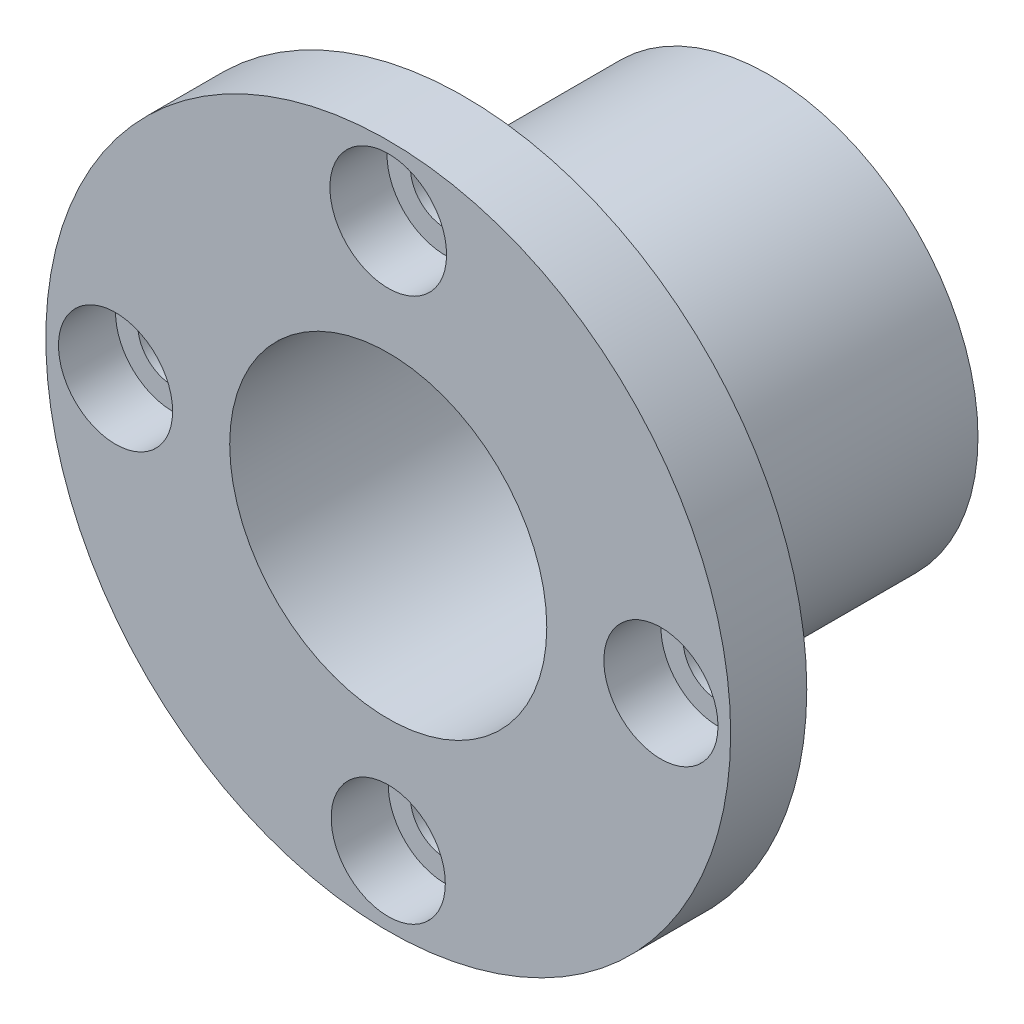
ISO-10303-21;
HEADER;
FILE_DESCRIPTION(('STEP AP214'),'2;1');
FILE_NAME('part.step','',(''),(''),'','','');
FILE_SCHEMA(('AUTOMOTIVE_DESIGN { 1 0 10303 214 1 1 1 1 }'));
ENDSEC;
DATA;
#1=APPLICATION_CONTEXT('core data for automotive mechanical design processes');
#2=APPLICATION_PROTOCOL_DEFINITION('international standard','automotive_design',2000,#1);
#3=PRODUCT_CONTEXT('',#1,'mechanical');
#4=PRODUCT('Part','Part','',(#3));
#5=PRODUCT_RELATED_PRODUCT_CATEGORY('part','',(#4));
#6=PRODUCT_DEFINITION_FORMATION('','',#4);
#7=PRODUCT_DEFINITION_CONTEXT('part definition',#1,'design');
#8=PRODUCT_DEFINITION('design','',#6,#7);
#9=PRODUCT_DEFINITION_SHAPE('','',#8);
#10=(LENGTH_UNIT() NAMED_UNIT(*) SI_UNIT(.MILLI.,.METRE.));
#11=(NAMED_UNIT(*) PLANE_ANGLE_UNIT() SI_UNIT($,.RADIAN.));
#12=(NAMED_UNIT(*) SI_UNIT($,.STERADIAN.) SOLID_ANGLE_UNIT());
#13=UNCERTAINTY_MEASURE_WITH_UNIT(LENGTH_MEASURE(1.E-05),#10,'distance_accuracy_value','');
#14=(GEOMETRIC_REPRESENTATION_CONTEXT(3) GLOBAL_UNCERTAINTY_ASSIGNED_CONTEXT((#13)) GLOBAL_UNIT_ASSIGNED_CONTEXT((#10,
#11,#12)) REPRESENTATION_CONTEXT('',''));
#15=CARTESIAN_POINT('',(0.,0.,0.));
#16=DIRECTION('',(0.,0.,1.));
#17=DIRECTION('',(1.,0.,0.));
#18=AXIS2_PLACEMENT_3D('',#15,#16,#17);
#19=CARTESIAN_POINT('',(-21.5,0.,-18.));
#20=DIRECTION('',(0.,0.,1.));
#21=DIRECTION('',(1.,0.,0.));
#22=AXIS2_PLACEMENT_3D('',#19,#20,#21);
#23=CYLINDRICAL_SURFACE('',#22,2.75);
#24=CARTESIAN_POINT('',(-21.5,0.,0.));
#25=DIRECTION('',(0.,0.,1.));
#26=DIRECTION('',(1.,0.,0.));
#27=AXIS2_PLACEMENT_3D('',#24,#25,#26);
#28=CIRCLE('',#27,2.75);
#29=CARTESIAN_POINT('',(-18.75,0.,0.));
#30=VERTEX_POINT('',#29);
#31=EDGE_CURVE('E67',#30,#30,#28,.T.);
#32=ORIENTED_EDGE('',*,*,#31,.F.);
#33=EDGE_LOOP('',(#32));
#34=FACE_BOUND('',#33,.T.);
#35=CARTESIAN_POINT('',(-21.5,0.,1.5));
#36=DIRECTION('',(0.,0.,1.));
#37=DIRECTION('',(1.,0.,0.));
#38=AXIS2_PLACEMENT_3D('',#35,#36,#37);
#39=CIRCLE('',#38,2.75);
#40=CARTESIAN_POINT('',(-18.75,0.,1.5));
#41=VERTEX_POINT('',#40);
#42=EDGE_CURVE('E43',#41,#41,#39,.F.);
#43=ORIENTED_EDGE('',*,*,#42,.F.);
#44=EDGE_LOOP('',(#43));
#45=FACE_BOUND('',#44,.T.);
#46=ADVANCED_FACE('F39',(#34,#45),#23,.F.);
#47=CARTESIAN_POINT('',(21.5,0.,-18.));
#48=DIRECTION('',(0.,0.,1.));
#49=DIRECTION('',(1.,0.,0.));
#50=AXIS2_PLACEMENT_3D('',#47,#48,#49);
#51=CYLINDRICAL_SURFACE('',#50,2.75);
#52=CARTESIAN_POINT('',(21.5,0.,0.));
#53=DIRECTION('',(0.,0.,1.));
#54=DIRECTION('',(1.,0.,0.));
#55=AXIS2_PLACEMENT_3D('',#52,#53,#54);
#56=CIRCLE('',#55,2.75);
#57=CARTESIAN_POINT('',(24.25,0.,0.));
#58=VERTEX_POINT('',#57);
#59=EDGE_CURVE('E71',#58,#58,#56,.T.);
#60=ORIENTED_EDGE('',*,*,#59,.F.);
#61=EDGE_LOOP('',(#60));
#62=FACE_BOUND('',#61,.T.);
#63=CARTESIAN_POINT('',(21.5,0.,1.5));
#64=DIRECTION('',(0.,0.,1.));
#65=DIRECTION('',(1.,0.,0.));
#66=AXIS2_PLACEMENT_3D('',#63,#64,#65);
#67=CIRCLE('',#66,2.75);
#68=CARTESIAN_POINT('',(24.25,0.,1.5));
#69=VERTEX_POINT('',#68);
#70=EDGE_CURVE('E62',#69,#69,#67,.F.);
#71=ORIENTED_EDGE('',*,*,#70,.F.);
#72=EDGE_LOOP('',(#71));
#73=FACE_BOUND('',#72,.T.);
#74=ADVANCED_FACE('F119',(#62,#73),#51,.F.);
#75=CARTESIAN_POINT('',(0.,-21.5,-18.));
#76=DIRECTION('',(0.,0.,1.));
#77=DIRECTION('',(1.,0.,0.));
#78=AXIS2_PLACEMENT_3D('',#75,#76,#77);
#79=CYLINDRICAL_SURFACE('',#78,2.75);
#80=CARTESIAN_POINT('',(0.,-21.5,0.));
#81=DIRECTION('',(0.,0.,1.));
#82=DIRECTION('',(1.,0.,0.));
#83=AXIS2_PLACEMENT_3D('',#80,#81,#82);
#84=CIRCLE('',#83,2.75);
#85=CARTESIAN_POINT('',(2.75,-21.5,0.));
#86=VERTEX_POINT('',#85);
#87=EDGE_CURVE('E76',#86,#86,#84,.T.);
#88=ORIENTED_EDGE('',*,*,#87,.F.);
#89=EDGE_LOOP('',(#88));
#90=FACE_BOUND('',#89,.T.);
#91=CARTESIAN_POINT('',(0.,-21.5,1.5));
#92=DIRECTION('',(0.,0.,1.));
#93=DIRECTION('',(1.,0.,0.));
#94=AXIS2_PLACEMENT_3D('',#91,#92,#93);
#95=CIRCLE('',#94,2.75);
#96=CARTESIAN_POINT('',(2.75,-21.5,1.5));
#97=VERTEX_POINT('',#96);
#98=EDGE_CURVE('E59',#97,#97,#95,.F.);
#99=ORIENTED_EDGE('',*,*,#98,.F.);
#100=EDGE_LOOP('',(#99));
#101=FACE_BOUND('',#100,.T.);
#102=ADVANCED_FACE('F115',(#90,#101),#79,.F.);
#103=CARTESIAN_POINT('',(0.,21.5,-18.));
#104=DIRECTION('',(0.,0.,1.));
#105=DIRECTION('',(1.,0.,0.));
#106=AXIS2_PLACEMENT_3D('',#103,#104,#105);
#107=CYLINDRICAL_SURFACE('',#106,2.75);
#108=CARTESIAN_POINT('',(0.,21.5,0.));
#109=DIRECTION('',(0.,0.,1.));
#110=DIRECTION('',(1.,0.,0.));
#111=AXIS2_PLACEMENT_3D('',#108,#109,#110);
#112=CIRCLE('',#111,2.75);
#113=CARTESIAN_POINT('',(2.75,21.5,0.));
#114=VERTEX_POINT('',#113);
#115=EDGE_CURVE('E84',#114,#114,#112,.T.);
#116=ORIENTED_EDGE('',*,*,#115,.F.);
#117=EDGE_LOOP('',(#116));
#118=FACE_BOUND('',#117,.T.);
#119=CARTESIAN_POINT('',(0.,21.5,1.5));
#120=DIRECTION('',(0.,0.,1.));
#121=DIRECTION('',(1.,0.,0.));
#122=AXIS2_PLACEMENT_3D('',#119,#120,#121);
#123=CIRCLE('',#122,2.75);
#124=CARTESIAN_POINT('',(2.75,21.5,1.5));
#125=VERTEX_POINT('',#124);
#126=EDGE_CURVE('E56',#125,#125,#123,.F.);
#127=ORIENTED_EDGE('',*,*,#126,.F.);
#128=EDGE_LOOP('',(#127));
#129=FACE_BOUND('',#128,.T.);
#130=ADVANCED_FACE('F105',(#118,#129),#107,.F.);
#131=CARTESIAN_POINT('',(0.,0.,0.));
#132=DIRECTION('',(0.,0.,1.));
#133=DIRECTION('',(1.,0.,0.));
#134=AXIS2_PLACEMENT_3D('',#131,#132,#133);
#135=PLANE('',#134);
#136=ORIENTED_EDGE('',*,*,#115,.T.);
#137=EDGE_LOOP('',(#136));
#138=FACE_BOUND('',#137,.T.);
#139=ORIENTED_EDGE('',*,*,#87,.T.);
#140=EDGE_LOOP('',(#139));
#141=FACE_BOUND('',#140,.T.);
#142=ORIENTED_EDGE('',*,*,#59,.T.);
#143=EDGE_LOOP('',(#142));
#144=FACE_BOUND('',#143,.T.);
#145=ORIENTED_EDGE('',*,*,#31,.T.);
#146=EDGE_LOOP('',(#145));
#147=FACE_BOUND('',#146,.T.);
#148=CARTESIAN_POINT('',(0.,0.,0.));
#149=DIRECTION('',(0.,0.,1.));
#150=DIRECTION('',(1.,0.,0.));
#151=AXIS2_PLACEMENT_3D('',#148,#149,#150);
#152=CIRCLE('',#151,27.);
#153=CARTESIAN_POINT('',(27.,0.,0.));
#154=VERTEX_POINT('',#153);
#155=EDGE_CURVE('E52',#154,#154,#152,.T.);
#156=ORIENTED_EDGE('',*,*,#155,.F.);
#157=EDGE_LOOP('',(#156));
#158=FACE_BOUND('',#157,.T.);
#159=CARTESIAN_POINT('',(0.,0.,0.));
#160=DIRECTION('',(0.,0.,1.));
#161=DIRECTION('',(1.,0.,0.));
#162=AXIS2_PLACEMENT_3D('',#159,#160,#161);
#163=CIRCLE('',#162,16.5);
#164=CARTESIAN_POINT('',(16.5,0.,0.));
#165=VERTEX_POINT('',#164);
#166=EDGE_CURVE('E10',#165,#165,#163,.F.);
#167=ORIENTED_EDGE('',*,*,#166,.F.);
#168=EDGE_LOOP('',(#167));
#169=FACE_BOUND('',#168,.T.);
#170=ADVANCED_FACE('F101',(#138,#141,#144,#147,#158,#169),#135,.F.);
#171=CARTESIAN_POINT('',(0.,0.,6.));
#172=DIRECTION('',(0.,0.,1.));
#173=DIRECTION('',(1.,0.,0.));
#174=AXIS2_PLACEMENT_3D('',#171,#172,#173);
#175=PLANE('',#174);
#176=CARTESIAN_POINT('',(0.,21.5,6.));
#177=DIRECTION('',(0.,0.,1.));
#178=DIRECTION('',(1.,0.,0.));
#179=AXIS2_PLACEMENT_3D('',#176,#177,#178);
#180=CIRCLE('',#179,4.6);
#181=CARTESIAN_POINT('',(4.6,21.5,6.));
#182=VERTEX_POINT('',#181);
#183=EDGE_CURVE('E305',#182,#182,#180,.T.);
#184=ORIENTED_EDGE('',*,*,#183,.F.);
#185=EDGE_LOOP('',(#184));
#186=FACE_BOUND('',#185,.T.);
#187=CARTESIAN_POINT('',(21.5,0.,6.));
#188=DIRECTION('',(0.,0.,1.));
#189=DIRECTION('',(1.,0.,0.));
#190=AXIS2_PLACEMENT_3D('',#187,#188,#189);
#191=CIRCLE('',#190,4.5);
#192=CARTESIAN_POINT('',(26.,0.,6.));
#193=VERTEX_POINT('',#192);
#194=EDGE_CURVE('E302',#193,#193,#191,.T.);
#195=ORIENTED_EDGE('',*,*,#194,.F.);
#196=EDGE_LOOP('',(#195));
#197=FACE_BOUND('',#196,.T.);
#198=CARTESIAN_POINT('',(0.,-21.5,6.));
#199=DIRECTION('',(0.,0.,1.));
#200=DIRECTION('',(1.,0.,0.));
#201=AXIS2_PLACEMENT_3D('',#198,#199,#200);
#202=CIRCLE('',#201,4.5);
#203=CARTESIAN_POINT('',(4.5,-21.5,6.));
#204=VERTEX_POINT('',#203);
#205=EDGE_CURVE('E294',#204,#204,#202,.T.);
#206=ORIENTED_EDGE('',*,*,#205,.F.);
#207=EDGE_LOOP('',(#206));
#208=FACE_BOUND('',#207,.T.);
#209=CARTESIAN_POINT('',(-21.5,0.,6.));
#210=DIRECTION('',(0.,0.,1.));
#211=DIRECTION('',(1.,0.,0.));
#212=AXIS2_PLACEMENT_3D('',#209,#210,#211);
#213=CIRCLE('',#212,4.5);
#214=CARTESIAN_POINT('',(-17.,0.,6.));
#215=VERTEX_POINT('',#214);
#216=EDGE_CURVE('E290',#215,#215,#213,.T.);
#217=ORIENTED_EDGE('',*,*,#216,.F.);
#218=EDGE_LOOP('',(#217));
#219=FACE_BOUND('',#218,.T.);
#220=CARTESIAN_POINT('',(0.,0.,6.));
#221=DIRECTION('',(0.,0.,1.));
#222=DIRECTION('',(1.,0.,0.));
#223=AXIS2_PLACEMENT_3D('',#220,#221,#222);
#224=CIRCLE('',#223,27.);
#225=CARTESIAN_POINT('',(27.,0.,6.));
#226=VERTEX_POINT('',#225);
#227=EDGE_CURVE('E47',#226,#226,#224,.T.);
#228=ORIENTED_EDGE('',*,*,#227,.T.);
#229=EDGE_LOOP('',(#228));
#230=FACE_BOUND('',#229,.T.);
#231=CARTESIAN_POINT('',(0.,0.,6.));
#232=DIRECTION('',(0.,0.,1.));
#233=DIRECTION('',(1.,0.,0.));
#234=AXIS2_PLACEMENT_3D('',#231,#232,#233);
#235=CIRCLE('',#234,12.5);
#236=CARTESIAN_POINT('',(12.5,0.,6.));
#237=VERTEX_POINT('',#236);
#238=EDGE_CURVE('E93',#237,#237,#235,.T.);
#239=ORIENTED_EDGE('',*,*,#238,.F.);
#240=EDGE_LOOP('',(#239));
#241=FACE_BOUND('',#240,.T.);
#242=ADVANCED_FACE('F104',(#186,#197,#208,#219,#230,#241),#175,.T.);
#243=CARTESIAN_POINT('',(0.,0.,6.));
#244=DIRECTION('',(0.,0.,-1.));
#245=DIRECTION('',(-1.,0.,0.));
#246=AXIS2_PLACEMENT_3D('',#243,#244,#245);
#247=CYLINDRICAL_SURFACE('',#246,27.);
#248=ORIENTED_EDGE('',*,*,#227,.F.);
#249=EDGE_LOOP('',(#248));
#250=FACE_BOUND('',#249,.T.);
#251=ORIENTED_EDGE('',*,*,#155,.T.);
#252=EDGE_LOOP('',(#251));
#253=FACE_BOUND('',#252,.T.);
#254=ADVANCED_FACE('F41',(#250,#253),#247,.T.);
#255=CARTESIAN_POINT('',(0.,0.,6.));
#256=DIRECTION('',(0.,0.,-1.));
#257=DIRECTION('',(-1.,0.,0.));
#258=AXIS2_PLACEMENT_3D('',#255,#256,#257);
#259=CYLINDRICAL_SURFACE('',#258,12.5);
#260=ORIENTED_EDGE('',*,*,#238,.T.);
#261=EDGE_LOOP('',(#260));
#262=FACE_BOUND('',#261,.T.);
#263=CARTESIAN_POINT('',(0.,0.,-24.));
#264=DIRECTION('',(0.,0.,-1.));
#265=DIRECTION('',(-1.,0.,0.));
#266=AXIS2_PLACEMENT_3D('',#263,#264,#265);
#267=CIRCLE('',#266,12.5);
#268=CARTESIAN_POINT('',(-12.5,0.,-24.));
#269=VERTEX_POINT('',#268);
#270=EDGE_CURVE('E87',#269,#269,#267,.T.);
#271=ORIENTED_EDGE('',*,*,#270,.T.);
#272=EDGE_LOOP('',(#271));
#273=FACE_BOUND('',#272,.T.);
#274=ADVANCED_FACE('F134',(#262,#273),#259,.F.);
#275=CARTESIAN_POINT('',(0.,0.,-24.));
#276=DIRECTION('',(0.,0.,-1.));
#277=DIRECTION('',(-1.,0.,0.));
#278=AXIS2_PLACEMENT_3D('',#275,#276,#277);
#279=PLANE('',#278);
#280=CARTESIAN_POINT('',(0.,0.,-24.));
#281=DIRECTION('',(0.,0.,-1.));
#282=DIRECTION('',(-1.,0.,0.));
#283=AXIS2_PLACEMENT_3D('',#280,#281,#282);
#284=CIRCLE('',#283,16.5);
#285=CARTESIAN_POINT('',(-16.5,0.,-24.));
#286=VERTEX_POINT('',#285);
#287=EDGE_CURVE('E90',#286,#286,#284,.T.);
#288=ORIENTED_EDGE('',*,*,#287,.T.);
#289=EDGE_LOOP('',(#288));
#290=FACE_BOUND('',#289,.T.);
#291=ORIENTED_EDGE('',*,*,#270,.F.);
#292=EDGE_LOOP('',(#291));
#293=FACE_BOUND('',#292,.T.);
#294=ADVANCED_FACE('F130',(#290,#293),#279,.T.);
#295=CARTESIAN_POINT('',(0.,0.,-24.));
#296=DIRECTION('',(0.,0.,1.));
#297=DIRECTION('',(1.,0.,0.));
#298=AXIS2_PLACEMENT_3D('',#295,#296,#297);
#299=CYLINDRICAL_SURFACE('',#298,16.5);
#300=ORIENTED_EDGE('',*,*,#287,.F.);
#301=EDGE_LOOP('',(#300));
#302=FACE_BOUND('',#301,.T.);
#303=ORIENTED_EDGE('',*,*,#166,.T.);
#304=EDGE_LOOP('',(#303));
#305=FACE_BOUND('',#304,.T.);
#306=ADVANCED_FACE('F133',(#302,#305),#299,.T.);
#307=CARTESIAN_POINT('',(0.,21.5,1.5));
#308=DIRECTION('',(0.,0.,1.));
#309=DIRECTION('',(1.,0.,0.));
#310=AXIS2_PLACEMENT_3D('',#307,#308,#309);
#311=PLANE('',#310);
#312=CARTESIAN_POINT('',(0.,21.5,1.5));
#313=DIRECTION('',(0.,0.,1.));
#314=DIRECTION('',(1.,0.,0.));
#315=AXIS2_PLACEMENT_3D('',#312,#313,#314);
#316=CIRCLE('',#315,4.6);
#317=CARTESIAN_POINT('',(4.6,21.5,1.5));
#318=VERTEX_POINT('',#317);
#319=EDGE_CURVE('E60',#318,#318,#316,.T.);
#320=ORIENTED_EDGE('',*,*,#319,.T.);
#321=EDGE_LOOP('',(#320));
#322=FACE_BOUND('',#321,.T.);
#323=ORIENTED_EDGE('',*,*,#126,.T.);
#324=EDGE_LOOP('',(#323));
#325=FACE_BOUND('',#324,.T.);
#326=ADVANCED_FACE('F137',(#322,#325),#311,.T.);
#327=CARTESIAN_POINT('',(0.,21.5,1.5));
#328=DIRECTION('',(0.,0.,1.));
#329=DIRECTION('',(1.,0.,0.));
#330=AXIS2_PLACEMENT_3D('',#327,#328,#329);
#331=CYLINDRICAL_SURFACE('',#330,4.6);
#332=ORIENTED_EDGE('',*,*,#319,.F.);
#333=EDGE_LOOP('',(#332));
#334=FACE_BOUND('',#333,.T.);
#335=ORIENTED_EDGE('',*,*,#183,.T.);
#336=EDGE_LOOP('',(#335));
#337=FACE_BOUND('',#336,.T.);
#338=ADVANCED_FACE('F210',(#334,#337),#331,.F.);
#339=CARTESIAN_POINT('',(0.,-21.5,1.5));
#340=DIRECTION('',(0.,0.,1.));
#341=DIRECTION('',(1.,0.,0.));
#342=AXIS2_PLACEMENT_3D('',#339,#340,#341);
#343=PLANE('',#342);
#344=CARTESIAN_POINT('',(0.,-21.5,1.5));
#345=DIRECTION('',(0.,0.,1.));
#346=DIRECTION('',(1.,0.,0.));
#347=AXIS2_PLACEMENT_3D('',#344,#345,#346);
#348=CIRCLE('',#347,4.5);
#349=CARTESIAN_POINT('',(4.5,-21.5,1.5));
#350=VERTEX_POINT('',#349);
#351=EDGE_CURVE('E292',#350,#350,#348,.T.);
#352=ORIENTED_EDGE('',*,*,#351,.T.);
#353=EDGE_LOOP('',(#352));
#354=FACE_BOUND('',#353,.T.);
#355=ORIENTED_EDGE('',*,*,#98,.T.);
#356=EDGE_LOOP('',(#355));
#357=FACE_BOUND('',#356,.T.);
#358=ADVANCED_FACE('F219',(#354,#357),#343,.T.);
#359=CARTESIAN_POINT('',(0.,-21.5,1.5));
#360=DIRECTION('',(0.,0.,1.));
#361=DIRECTION('',(1.,0.,0.));
#362=AXIS2_PLACEMENT_3D('',#359,#360,#361);
#363=CYLINDRICAL_SURFACE('',#362,4.5);
#364=ORIENTED_EDGE('',*,*,#351,.F.);
#365=EDGE_LOOP('',(#364));
#366=FACE_BOUND('',#365,.T.);
#367=ORIENTED_EDGE('',*,*,#205,.T.);
#368=EDGE_LOOP('',(#367));
#369=FACE_BOUND('',#368,.T.);
#370=ADVANCED_FACE('F228',(#366,#369),#363,.F.);
#371=CARTESIAN_POINT('',(21.5,0.,1.5));
#372=DIRECTION('',(0.,0.,1.));
#373=DIRECTION('',(1.,0.,0.));
#374=AXIS2_PLACEMENT_3D('',#371,#372,#373);
#375=PLANE('',#374);
#376=CARTESIAN_POINT('',(21.5,0.,1.5));
#377=DIRECTION('',(0.,0.,1.));
#378=DIRECTION('',(1.,0.,0.));
#379=AXIS2_PLACEMENT_3D('',#376,#377,#378);
#380=CIRCLE('',#379,4.5);
#381=CARTESIAN_POINT('',(26.,0.,1.5));
#382=VERTEX_POINT('',#381);
#383=EDGE_CURVE('E299',#382,#382,#380,.T.);
#384=ORIENTED_EDGE('',*,*,#383,.T.);
#385=EDGE_LOOP('',(#384));
#386=FACE_BOUND('',#385,.T.);
#387=ORIENTED_EDGE('',*,*,#70,.T.);
#388=EDGE_LOOP('',(#387));
#389=FACE_BOUND('',#388,.T.);
#390=ADVANCED_FACE('F237',(#386,#389),#375,.T.);
#391=CARTESIAN_POINT('',(21.5,0.,1.5));
#392=DIRECTION('',(0.,0.,1.));
#393=DIRECTION('',(1.,0.,0.));
#394=AXIS2_PLACEMENT_3D('',#391,#392,#393);
#395=CYLINDRICAL_SURFACE('',#394,4.5);
#396=ORIENTED_EDGE('',*,*,#383,.F.);
#397=EDGE_LOOP('',(#396));
#398=FACE_BOUND('',#397,.T.);
#399=ORIENTED_EDGE('',*,*,#194,.T.);
#400=EDGE_LOOP('',(#399));
#401=FACE_BOUND('',#400,.T.);
#402=ADVANCED_FACE('F246',(#398,#401),#395,.F.);
#403=CARTESIAN_POINT('',(-21.5,0.,1.5));
#404=DIRECTION('',(0.,0.,1.));
#405=DIRECTION('',(1.,0.,0.));
#406=AXIS2_PLACEMENT_3D('',#403,#404,#405);
#407=PLANE('',#406);
#408=CARTESIAN_POINT('',(-21.5,0.,1.5));
#409=DIRECTION('',(0.,0.,1.));
#410=DIRECTION('',(1.,0.,0.));
#411=AXIS2_PLACEMENT_3D('',#408,#409,#410);
#412=CIRCLE('',#411,4.5);
#413=CARTESIAN_POINT('',(-17.,0.,1.5));
#414=VERTEX_POINT('',#413);
#415=EDGE_CURVE('E79',#414,#414,#412,.T.);
#416=ORIENTED_EDGE('',*,*,#415,.T.);
#417=EDGE_LOOP('',(#416));
#418=FACE_BOUND('',#417,.T.);
#419=ORIENTED_EDGE('',*,*,#42,.T.);
#420=EDGE_LOOP('',(#419));
#421=FACE_BOUND('',#420,.T.);
#422=ADVANCED_FACE('F255',(#418,#421),#407,.T.);
#423=CARTESIAN_POINT('',(-21.5,0.,1.5));
#424=DIRECTION('',(0.,0.,1.));
#425=DIRECTION('',(1.,0.,0.));
#426=AXIS2_PLACEMENT_3D('',#423,#424,#425);
#427=CYLINDRICAL_SURFACE('',#426,4.5);
#428=ORIENTED_EDGE('',*,*,#415,.F.);
#429=EDGE_LOOP('',(#428));
#430=FACE_BOUND('',#429,.T.);
#431=ORIENTED_EDGE('',*,*,#216,.T.);
#432=EDGE_LOOP('',(#431));
#433=FACE_BOUND('',#432,.T.);
#434=ADVANCED_FACE('F264',(#430,#433),#427,.F.);
#435=CLOSED_SHELL('',(#46,#74,#102,#130,#170,#242,#254,#274,#294,#306,#326,#338,#358,#370,#390,
#402,#422,#434));
#436=MANIFOLD_SOLID_BREP('B2',#435);
#437=ADVANCED_BREP_SHAPE_REPRESENTATION('',(#18,#436),#14);
#438=SHAPE_DEFINITION_REPRESENTATION(#9,#437);
ENDSEC;
END-ISO-10303-21;
